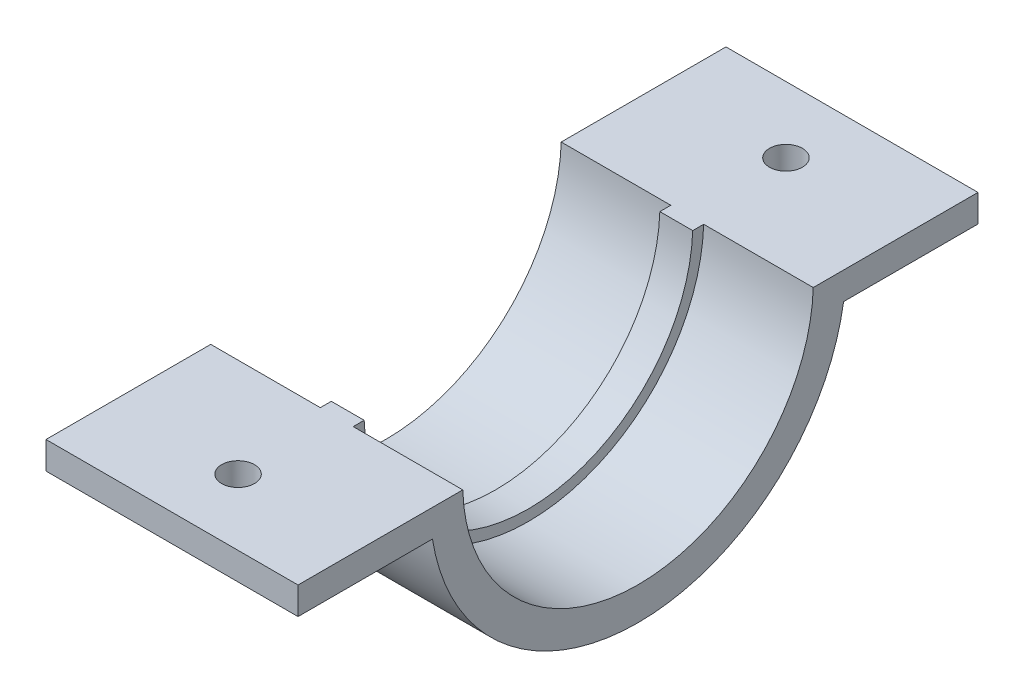
ISO-10303-21;
HEADER;
FILE_DESCRIPTION(('STEP AP214'),'2;1');
FILE_NAME('part.step','',(''),(''),'','','');
FILE_SCHEMA(('AUTOMOTIVE_DESIGN { 1 0 10303 214 1 1 1 1 }'));
ENDSEC;
DATA;
#1=APPLICATION_CONTEXT('core data for automotive mechanical design processes');
#2=APPLICATION_PROTOCOL_DEFINITION('international standard','automotive_design',2000,#1);
#3=PRODUCT_CONTEXT('',#1,'mechanical');
#4=PRODUCT('Part','Part','',(#3));
#5=PRODUCT_RELATED_PRODUCT_CATEGORY('part','',(#4));
#6=PRODUCT_DEFINITION_FORMATION('','',#4);
#7=PRODUCT_DEFINITION_CONTEXT('part definition',#1,'design');
#8=PRODUCT_DEFINITION('design','',#6,#7);
#9=PRODUCT_DEFINITION_SHAPE('','',#8);
#10=(LENGTH_UNIT() NAMED_UNIT(*) SI_UNIT(.MILLI.,.METRE.));
#11=(NAMED_UNIT(*) PLANE_ANGLE_UNIT() SI_UNIT($,.RADIAN.));
#12=(NAMED_UNIT(*) SI_UNIT($,.STERADIAN.) SOLID_ANGLE_UNIT());
#13=UNCERTAINTY_MEASURE_WITH_UNIT(LENGTH_MEASURE(1.E-05),#10,'distance_accuracy_value','');
#14=(GEOMETRIC_REPRESENTATION_CONTEXT(3) GLOBAL_UNCERTAINTY_ASSIGNED_CONTEXT((#13)) GLOBAL_UNIT_ASSIGNED_CONTEXT((#10,
#11,#12)) REPRESENTATION_CONTEXT('',''));
#15=CARTESIAN_POINT('',(0.,0.,0.));
#16=DIRECTION('',(0.,0.,1.));
#17=DIRECTION('',(1.,0.,0.));
#18=AXIS2_PLACEMENT_3D('',#15,#16,#17);
#19=CARTESIAN_POINT('',(-11.5,0.,-16.));
#20=DIRECTION('',(1.,0.,0.));
#21=DIRECTION('',(0.,0.,-1.));
#22=AXIS2_PLACEMENT_3D('',#19,#20,#21);
#23=PLANE('',#22);
#24=DIRECTION('',(0.,-1.,0.));
#25=VECTOR('',#24,1.);
#26=CARTESIAN_POINT('',(-11.5,3.,31.0262507904691));
#27=LINE('',#26,#25);
#28=CARTESIAN_POINT('',(-11.5,-0.5,31.0262507904691));
#29=VERTEX_POINT('',#28);
#30=CARTESIAN_POINT('',(-11.5,-3.,31.0262507904691));
#31=VERTEX_POINT('',#30);
#32=EDGE_CURVE('E181',#29,#31,#27,.T.);
#33=ORIENTED_EDGE('',*,*,#32,.F.);
#34=DIRECTION('',(0.,0.,-1.));
#35=VECTOR('',#34,1.);
#36=CARTESIAN_POINT('',(-11.5,-0.5,-16.));
#37=LINE('',#36,#35);
#38=CARTESIAN_POINT('',(-11.5,-0.5,15.9921855917195));
#39=VERTEX_POINT('',#38);
#40=EDGE_CURVE('E83',#29,#39,#37,.T.);
#41=ORIENTED_EDGE('',*,*,#40,.T.);
#42=CARTESIAN_POINT('',(-11.5,0.,0.));
#43=DIRECTION('',(-1.,0.,0.));
#44=DIRECTION('',(0.,0.,1.));
#45=AXIS2_PLACEMENT_3D('',#42,#43,#44);
#46=CIRCLE('',#45,16.);
#47=CARTESIAN_POINT('',(-11.5,-0.5,-15.9921855917195));
#48=VERTEX_POINT('',#47);
#49=EDGE_CURVE('E175',#48,#39,#46,.T.);
#50=ORIENTED_EDGE('',*,*,#49,.F.);
#51=CARTESIAN_POINT('',(-11.5,-0.5,-31.0262507904691));
#52=VERTEX_POINT('',#51);
#53=EDGE_CURVE('E207',#48,#52,#37,.T.);
#54=ORIENTED_EDGE('',*,*,#53,.T.);
#55=DIRECTION('',(0.,1.,0.));
#56=VECTOR('',#55,1.);
#57=CARTESIAN_POINT('',(-11.5,3.00000000000001,-31.0262507904691));
#58=LINE('',#57,#56);
#59=CARTESIAN_POINT('',(-11.5,-2.99999999999998,-31.0262507904691));
#60=VERTEX_POINT('',#59);
#61=EDGE_CURVE('E184',#60,#52,#58,.T.);
#62=ORIENTED_EDGE('',*,*,#61,.F.);
#63=DIRECTION('',(0.,0.,-1.));
#64=VECTOR('',#63,1.);
#65=CARTESIAN_POINT('',(-11.5,-2.99999999999999,-17.4601205824056));
#66=LINE('',#65,#64);
#67=CARTESIAN_POINT('',(-11.5,-2.99999999999998,-18.7616630392937));
#68=VERTEX_POINT('',#67);
#69=EDGE_CURVE('E225',#68,#60,#66,.T.);
#70=ORIENTED_EDGE('',*,*,#69,.F.);
#71=CARTESIAN_POINT('',(-11.5,0.,0.));
#72=DIRECTION('',(-1.,0.,0.));
#73=DIRECTION('',(0.,0.,1.));
#74=AXIS2_PLACEMENT_3D('',#71,#72,#73);
#75=CIRCLE('',#74,19.);
#76=CARTESIAN_POINT('',(-11.5,-3.,18.7616630392937));
#77=VERTEX_POINT('',#76);
#78=EDGE_CURVE('E212',#68,#77,#75,.T.);
#79=ORIENTED_EDGE('',*,*,#78,.T.);
#80=DIRECTION('',(0.,0.,-1.));
#81=VECTOR('',#80,1.);
#82=CARTESIAN_POINT('',(-11.5,-3.,17.4601205824056));
#83=LINE('',#82,#81);
#84=EDGE_CURVE('E228',#31,#77,#83,.T.);
#85=ORIENTED_EDGE('',*,*,#84,.F.);
#86=EDGE_LOOP('',(#33,#41,#50,#54,#62,#70,#79,#85));
#87=FACE_BOUND('',#86,.T.);
#88=ADVANCED_FACE('F40',(#87),#23,.F.);
#89=CARTESIAN_POINT('',(11.5,0.,-16.));
#90=DIRECTION('',(-1.,0.,0.));
#91=DIRECTION('',(0.,0.,1.));
#92=AXIS2_PLACEMENT_3D('',#89,#90,#91);
#93=PLANE('',#92);
#94=DIRECTION('',(0.,1.,0.));
#95=VECTOR('',#94,1.);
#96=CARTESIAN_POINT('',(11.5,3.00000000000001,-31.0262507904691));
#97=LINE('',#96,#95);
#98=CARTESIAN_POINT('',(11.5,-2.99999999999998,-31.0262507904691));
#99=VERTEX_POINT('',#98);
#100=CARTESIAN_POINT('',(11.5,-0.5,-31.0262507904691));
#101=VERTEX_POINT('',#100);
#102=EDGE_CURVE('E44',#99,#101,#97,.T.);
#103=ORIENTED_EDGE('',*,*,#102,.T.);
#104=DIRECTION('',(0.,0.,1.));
#105=VECTOR('',#104,1.);
#106=CARTESIAN_POINT('',(11.5,-0.5,-16.));
#107=LINE('',#106,#105);
#108=CARTESIAN_POINT('',(11.5,-0.5,-15.9921855917195));
#109=VERTEX_POINT('',#108);
#110=EDGE_CURVE('E134',#101,#109,#107,.T.);
#111=ORIENTED_EDGE('',*,*,#110,.T.);
#112=CARTESIAN_POINT('',(11.5,0.,0.));
#113=DIRECTION('',(-1.,0.,0.));
#114=DIRECTION('',(0.,0.,1.));
#115=AXIS2_PLACEMENT_3D('',#112,#113,#114);
#116=CIRCLE('',#115,16.);
#117=CARTESIAN_POINT('',(11.5,-0.5,15.9921855917195));
#118=VERTEX_POINT('',#117);
#119=EDGE_CURVE('E148',#109,#118,#116,.T.);
#120=ORIENTED_EDGE('',*,*,#119,.T.);
#121=CARTESIAN_POINT('',(11.5,-0.5,31.0262507904691));
#122=VERTEX_POINT('',#121);
#123=EDGE_CURVE('E151',#118,#122,#107,.T.);
#124=ORIENTED_EDGE('',*,*,#123,.T.);
#125=DIRECTION('',(0.,-1.,0.));
#126=VECTOR('',#125,1.);
#127=CARTESIAN_POINT('',(11.5,3.,31.0262507904691));
#128=LINE('',#127,#126);
#129=CARTESIAN_POINT('',(11.5,-3.,31.0262507904691));
#130=VERTEX_POINT('',#129);
#131=EDGE_CURVE('E154',#122,#130,#128,.T.);
#132=ORIENTED_EDGE('',*,*,#131,.T.);
#133=DIRECTION('',(0.,0.,-1.));
#134=VECTOR('',#133,1.);
#135=CARTESIAN_POINT('',(11.5,-3.,17.4601205824056));
#136=LINE('',#135,#134);
#137=CARTESIAN_POINT('',(11.5,-3.,18.7616630392938));
#138=VERTEX_POINT('',#137);
#139=EDGE_CURVE('E180',#130,#138,#136,.T.);
#140=ORIENTED_EDGE('',*,*,#139,.T.);
#141=CARTESIAN_POINT('',(11.5,0.,0.));
#142=DIRECTION('',(-1.,0.,0.));
#143=DIRECTION('',(0.,0.,1.));
#144=AXIS2_PLACEMENT_3D('',#141,#142,#143);
#145=CIRCLE('',#144,19.);
#146=CARTESIAN_POINT('',(11.5,-2.99999999999999,-18.7616630392938));
#147=VERTEX_POINT('',#146);
#148=EDGE_CURVE('E157',#147,#138,#145,.T.);
#149=ORIENTED_EDGE('',*,*,#148,.F.);
#150=DIRECTION('',(0.,0.,-1.));
#151=VECTOR('',#150,1.);
#152=CARTESIAN_POINT('',(11.5,-2.99999999999999,-17.4601205824056));
#153=LINE('',#152,#151);
#154=EDGE_CURVE('E161',#147,#99,#153,.T.);
#155=ORIENTED_EDGE('',*,*,#154,.T.);
#156=EDGE_LOOP('',(#103,#111,#120,#124,#132,#140,#149,#155));
#157=FACE_BOUND('',#156,.T.);
#158=ADVANCED_FACE('F146',(#157),#93,.F.);
#159=CARTESIAN_POINT('',(-71.7221553746751,0.,0.));
#160=DIRECTION('',(-1.,0.,0.));
#161=DIRECTION('',(0.,0.,1.));
#162=AXIS2_PLACEMENT_3D('',#159,#160,#161);
#163=CYLINDRICAL_SURFACE('',#162,16.);
#164=CARTESIAN_POINT('',(1.5,0.,0.));
#165=DIRECTION('',(-1.,0.,0.));
#166=DIRECTION('',(0.,0.,1.));
#167=AXIS2_PLACEMENT_3D('',#164,#165,#166);
#168=CIRCLE('',#167,16.);
#169=CARTESIAN_POINT('',(1.5,-0.5,-15.9921855917195));
#170=VERTEX_POINT('',#169);
#171=CARTESIAN_POINT('',(1.5,-0.5,15.9921855917195));
#172=VERTEX_POINT('',#171);
#173=EDGE_CURVE('E159',#170,#172,#168,.T.);
#174=ORIENTED_EDGE('',*,*,#173,.T.);
#175=DIRECTION('',(-1.,0.,0.));
#176=VECTOR('',#175,1.);
#177=CARTESIAN_POINT('',(-71.7221553746751,-0.5,15.9921855917195));
#178=LINE('',#177,#176);
#179=EDGE_CURVE('E59',#172,#118,#178,.F.);
#180=ORIENTED_EDGE('',*,*,#179,.T.);
#181=ORIENTED_EDGE('',*,*,#119,.F.);
#182=DIRECTION('',(-1.,0.,0.));
#183=VECTOR('',#182,1.);
#184=CARTESIAN_POINT('',(-71.7221553746751,-0.5,-15.9921855917195));
#185=LINE('',#184,#183);
#186=EDGE_CURVE('E130',#109,#170,#185,.T.);
#187=ORIENTED_EDGE('',*,*,#186,.T.);
#188=EDGE_LOOP('',(#174,#180,#181,#187));
#189=FACE_BOUND('',#188,.T.);
#190=ADVANCED_FACE('F152',(#189),#163,.F.);
#191=CARTESIAN_POINT('',(1.5,0.,-16.));
#192=DIRECTION('',(-1.,0.,0.));
#193=DIRECTION('',(0.,0.,1.));
#194=AXIS2_PLACEMENT_3D('',#191,#192,#193);
#195=PLANE('',#194);
#196=ORIENTED_EDGE('',*,*,#173,.F.);
#197=DIRECTION('',(0.,0.,1.));
#198=VECTOR('',#197,1.);
#199=CARTESIAN_POINT('',(1.5,-0.5,-16.));
#200=LINE('',#199,#198);
#201=CARTESIAN_POINT('',(1.5,-0.5,-14.991664350565));
#202=VERTEX_POINT('',#201);
#203=EDGE_CURVE('E137',#170,#202,#200,.T.);
#204=ORIENTED_EDGE('',*,*,#203,.T.);
#205=CARTESIAN_POINT('',(1.5,0.,0.));
#206=DIRECTION('',(-1.,0.,0.));
#207=DIRECTION('',(0.,0.,1.));
#208=AXIS2_PLACEMENT_3D('',#205,#206,#207);
#209=CIRCLE('',#208,15.);
#210=CARTESIAN_POINT('',(1.5,-0.5,14.991664350565));
#211=VERTEX_POINT('',#210);
#212=EDGE_CURVE('E162',#202,#211,#209,.T.);
#213=ORIENTED_EDGE('',*,*,#212,.T.);
#214=EDGE_CURVE('E165',#211,#172,#200,.T.);
#215=ORIENTED_EDGE('',*,*,#214,.T.);
#216=EDGE_LOOP('',(#196,#204,#213,#215));
#217=FACE_BOUND('',#216,.T.);
#218=ADVANCED_FACE('F270',(#217),#195,.F.);
#219=CARTESIAN_POINT('',(-71.7221553746751,0.,0.));
#220=DIRECTION('',(-1.,0.,0.));
#221=DIRECTION('',(0.,0.,1.));
#222=AXIS2_PLACEMENT_3D('',#219,#220,#221);
#223=CYLINDRICAL_SURFACE('',#222,15.);
#224=CARTESIAN_POINT('',(-1.5,0.,0.));
#225=DIRECTION('',(-1.,0.,0.));
#226=DIRECTION('',(0.,0.,1.));
#227=AXIS2_PLACEMENT_3D('',#224,#225,#226);
#228=CIRCLE('',#227,15.);
#229=CARTESIAN_POINT('',(-1.5,-0.5,-14.9916643505649));
#230=VERTEX_POINT('',#229);
#231=CARTESIAN_POINT('',(-1.5,-0.5,14.9916643505649));
#232=VERTEX_POINT('',#231);
#233=EDGE_CURVE('E166',#230,#232,#228,.T.);
#234=ORIENTED_EDGE('',*,*,#233,.T.);
#235=DIRECTION('',(-1.,0.,0.));
#236=VECTOR('',#235,1.);
#237=CARTESIAN_POINT('',(-71.7221553746751,-0.5,14.991664350565));
#238=LINE('',#237,#236);
#239=EDGE_CURVE('E169',#232,#211,#238,.F.);
#240=ORIENTED_EDGE('',*,*,#239,.T.);
#241=ORIENTED_EDGE('',*,*,#212,.F.);
#242=DIRECTION('',(-1.,0.,0.));
#243=VECTOR('',#242,1.);
#244=CARTESIAN_POINT('',(-71.7221553746751,-0.5,-14.991664350565));
#245=LINE('',#244,#243);
#246=EDGE_CURVE('E174',#202,#230,#245,.T.);
#247=ORIENTED_EDGE('',*,*,#246,.T.);
#248=EDGE_LOOP('',(#234,#240,#241,#247));
#249=FACE_BOUND('',#248,.T.);
#250=ADVANCED_FACE('F268',(#249),#223,.F.);
#251=CARTESIAN_POINT('',(-1.5,0.,-16.));
#252=DIRECTION('',(1.,0.,0.));
#253=DIRECTION('',(0.,0.,-1.));
#254=AXIS2_PLACEMENT_3D('',#251,#252,#253);
#255=PLANE('',#254);
#256=CARTESIAN_POINT('',(-1.5,0.,0.));
#257=DIRECTION('',(-1.,0.,0.));
#258=DIRECTION('',(0.,0.,1.));
#259=AXIS2_PLACEMENT_3D('',#256,#257,#258);
#260=CIRCLE('',#259,16.);
#261=CARTESIAN_POINT('',(-1.5,-0.5,-15.9921855917195));
#262=VERTEX_POINT('',#261);
#263=CARTESIAN_POINT('',(-1.5,-0.5,15.9921855917195));
#264=VERTEX_POINT('',#263);
#265=EDGE_CURVE('E170',#262,#264,#260,.T.);
#266=ORIENTED_EDGE('',*,*,#265,.T.);
#267=DIRECTION('',(0.,0.,-1.));
#268=VECTOR('',#267,1.);
#269=CARTESIAN_POINT('',(-1.5,-0.5,-16.));
#270=LINE('',#269,#268);
#271=EDGE_CURVE('E173',#264,#232,#270,.T.);
#272=ORIENTED_EDGE('',*,*,#271,.T.);
#273=ORIENTED_EDGE('',*,*,#233,.F.);
#274=EDGE_CURVE('E178',#230,#262,#270,.T.);
#275=ORIENTED_EDGE('',*,*,#274,.T.);
#276=EDGE_LOOP('',(#266,#272,#273,#275));
#277=FACE_BOUND('',#276,.T.);
#278=ADVANCED_FACE('F263',(#277),#255,.F.);
#279=CARTESIAN_POINT('',(-71.7221553746751,0.,0.));
#280=DIRECTION('',(-1.,0.,0.));
#281=DIRECTION('',(0.,0.,1.));
#282=AXIS2_PLACEMENT_3D('',#279,#280,#281);
#283=CYLINDRICAL_SURFACE('',#282,16.);
#284=ORIENTED_EDGE('',*,*,#49,.T.);
#285=DIRECTION('',(-1.,0.,0.));
#286=VECTOR('',#285,1.);
#287=CARTESIAN_POINT('',(-71.7221553746751,-0.5,15.9921855917195));
#288=LINE('',#287,#286);
#289=EDGE_CURVE('E79',#39,#264,#288,.F.);
#290=ORIENTED_EDGE('',*,*,#289,.T.);
#291=ORIENTED_EDGE('',*,*,#265,.F.);
#292=DIRECTION('',(-1.,0.,0.));
#293=VECTOR('',#292,1.);
#294=CARTESIAN_POINT('',(-71.7221553746751,-0.5,-15.9921855917195));
#295=LINE('',#294,#293);
#296=EDGE_CURVE('E187',#262,#48,#295,.T.);
#297=ORIENTED_EDGE('',*,*,#296,.T.);
#298=EDGE_LOOP('',(#284,#290,#291,#297));
#299=FACE_BOUND('',#298,.T.);
#300=ADVANCED_FACE('F261',(#299),#283,.F.);
#301=CARTESIAN_POINT('',(11.5,3.00000000000001,-31.0262507904691));
#302=DIRECTION('',(0.,0.,1.));
#303=DIRECTION('',(1.,0.,0.));
#304=AXIS2_PLACEMENT_3D('',#301,#302,#303);
#305=PLANE('',#304);
#306=ORIENTED_EDGE('',*,*,#61,.T.);
#307=DIRECTION('',(1.,0.,0.));
#308=VECTOR('',#307,1.);
#309=CARTESIAN_POINT('',(11.5,-0.5,-31.0262507904691));
#310=LINE('',#309,#308);
#311=EDGE_CURVE('E186',#52,#101,#310,.T.);
#312=ORIENTED_EDGE('',*,*,#311,.T.);
#313=ORIENTED_EDGE('',*,*,#102,.F.);
#314=DIRECTION('',(-1.,0.,0.));
#315=VECTOR('',#314,1.);
#316=CARTESIAN_POINT('',(11.5,-2.99999999999998,-31.0262507904691));
#317=LINE('',#316,#315);
#318=EDGE_CURVE('E191',#99,#60,#317,.T.);
#319=ORIENTED_EDGE('',*,*,#318,.T.);
#320=EDGE_LOOP('',(#306,#312,#313,#319));
#321=FACE_BOUND('',#320,.T.);
#322=ADVANCED_FACE('F220',(#321),#305,.F.);
#323=CARTESIAN_POINT('',(11.5,3.,31.0262507904691));
#324=DIRECTION('',(0.,0.,-1.));
#325=DIRECTION('',(-1.,0.,0.));
#326=AXIS2_PLACEMENT_3D('',#323,#324,#325);
#327=PLANE('',#326);
#328=ORIENTED_EDGE('',*,*,#131,.F.);
#329=DIRECTION('',(-1.,0.,0.));
#330=VECTOR('',#329,1.);
#331=CARTESIAN_POINT('',(11.5,-0.5,31.0262507904691));
#332=LINE('',#331,#330);
#333=EDGE_CURVE('E183',#122,#29,#332,.T.);
#334=ORIENTED_EDGE('',*,*,#333,.T.);
#335=ORIENTED_EDGE('',*,*,#32,.T.);
#336=DIRECTION('',(-1.,0.,0.));
#337=VECTOR('',#336,1.);
#338=CARTESIAN_POINT('',(11.5,-3.,31.0262507904691));
#339=LINE('',#338,#337);
#340=EDGE_CURVE('E11',#130,#31,#339,.T.);
#341=ORIENTED_EDGE('',*,*,#340,.F.);
#342=EDGE_LOOP('',(#328,#334,#335,#341));
#343=FACE_BOUND('',#342,.T.);
#344=ADVANCED_FACE('F260',(#343),#327,.F.);
#345=CARTESIAN_POINT('',(0.,-11.5,25.));
#346=DIRECTION('',(0.,1.,0.));
#347=DIRECTION('',(0.,0.,1.));
#348=AXIS2_PLACEMENT_3D('',#345,#346,#347);
#349=CYLINDRICAL_SURFACE('',#348,1.5);
#350=CARTESIAN_POINT('',(0.,-0.5,25.));
#351=DIRECTION('',(0.,-1.,0.));
#352=DIRECTION('',(0.,0.,-1.));
#353=AXIS2_PLACEMENT_3D('',#350,#351,#352);
#354=CIRCLE('',#353,1.5);
#355=CARTESIAN_POINT('',(0.,-0.5,23.5));
#356=VERTEX_POINT('',#355);
#357=EDGE_CURVE('E182',#356,#356,#354,.F.);
#358=ORIENTED_EDGE('',*,*,#357,.T.);
#359=EDGE_LOOP('',(#358));
#360=FACE_BOUND('',#359,.T.);
#361=CARTESIAN_POINT('',(0.,-3.,25.));
#362=DIRECTION('',(0.,1.,0.));
#363=DIRECTION('',(0.,0.,1.));
#364=AXIS2_PLACEMENT_3D('',#361,#362,#363);
#365=CIRCLE('',#364,1.5);
#366=CARTESIAN_POINT('',(0.,-3.,26.5));
#367=VERTEX_POINT('',#366);
#368=EDGE_CURVE('E230',#367,#367,#365,.T.);
#369=ORIENTED_EDGE('',*,*,#368,.F.);
#370=EDGE_LOOP('',(#369));
#371=FACE_BOUND('',#370,.T.);
#372=ADVANCED_FACE('F42',(#360,#371),#349,.F.);
#373=CARTESIAN_POINT('',(0.,-11.5,-25.));
#374=DIRECTION('',(0.,1.,0.));
#375=DIRECTION('',(0.,0.,1.));
#376=AXIS2_PLACEMENT_3D('',#373,#374,#375);
#377=CYLINDRICAL_SURFACE('',#376,1.5);
#378=CARTESIAN_POINT('',(0.,-0.5,-25.));
#379=DIRECTION('',(0.,-1.,0.));
#380=DIRECTION('',(0.,0.,-1.));
#381=AXIS2_PLACEMENT_3D('',#378,#379,#380);
#382=CIRCLE('',#381,1.5);
#383=CARTESIAN_POINT('',(0.,-0.5,-26.5));
#384=VERTEX_POINT('',#383);
#385=EDGE_CURVE('E211',#384,#384,#382,.F.);
#386=ORIENTED_EDGE('',*,*,#385,.T.);
#387=EDGE_LOOP('',(#386));
#388=FACE_BOUND('',#387,.T.);
#389=CARTESIAN_POINT('',(0.,-2.99999999999998,-25.));
#390=DIRECTION('',(0.,1.,0.));
#391=DIRECTION('',(0.,0.,1.));
#392=AXIS2_PLACEMENT_3D('',#389,#390,#391);
#393=CIRCLE('',#392,1.5);
#394=CARTESIAN_POINT('',(0.,-2.99999999999998,-23.5));
#395=VERTEX_POINT('',#394);
#396=EDGE_CURVE('E233',#395,#395,#393,.T.);
#397=ORIENTED_EDGE('',*,*,#396,.F.);
#398=EDGE_LOOP('',(#397));
#399=FACE_BOUND('',#398,.T.);
#400=ADVANCED_FACE('F289',(#388,#399),#377,.F.);
#401=CARTESIAN_POINT('',(-71.7221553746751,0.,0.));
#402=DIRECTION('',(-1.,0.,0.));
#403=DIRECTION('',(0.,0.,1.));
#404=AXIS2_PLACEMENT_3D('',#401,#402,#403);
#405=CYLINDRICAL_SURFACE('',#404,19.);
#406=DIRECTION('',(-1.,0.,0.));
#407=VECTOR('',#406,1.);
#408=CARTESIAN_POINT('',(-71.7221553746751,-3.,18.7616630392937));
#409=LINE('',#408,#407);
#410=EDGE_CURVE('E50',#77,#138,#409,.F.);
#411=ORIENTED_EDGE('',*,*,#410,.F.);
#412=ORIENTED_EDGE('',*,*,#78,.F.);
#413=DIRECTION('',(-1.,0.,0.));
#414=VECTOR('',#413,1.);
#415=CARTESIAN_POINT('',(-71.7221553746751,-2.99999999999999,-18.7616630392937));
#416=LINE('',#415,#414);
#417=EDGE_CURVE('E235',#147,#68,#416,.T.);
#418=ORIENTED_EDGE('',*,*,#417,.F.);
#419=ORIENTED_EDGE('',*,*,#148,.T.);
#420=EDGE_LOOP('',(#411,#412,#418,#419));
#421=FACE_BOUND('',#420,.T.);
#422=ADVANCED_FACE('F253',(#421),#405,.T.);
#423=CARTESIAN_POINT('',(11.5,-2.99999999999999,-17.4601205824056));
#424=DIRECTION('',(0.,1.,0.));
#425=DIRECTION('',(0.,0.,1.));
#426=AXIS2_PLACEMENT_3D('',#423,#424,#425);
#427=PLANE('',#426);
#428=ORIENTED_EDGE('',*,*,#396,.T.);
#429=EDGE_LOOP('',(#428));
#430=FACE_BOUND('',#429,.T.);
#431=ORIENTED_EDGE('',*,*,#154,.F.);
#432=ORIENTED_EDGE('',*,*,#417,.T.);
#433=ORIENTED_EDGE('',*,*,#69,.T.);
#434=ORIENTED_EDGE('',*,*,#318,.F.);
#435=EDGE_LOOP('',(#431,#432,#433,#434));
#436=FACE_BOUND('',#435,.T.);
#437=ADVANCED_FACE('F252',(#430,#436),#427,.F.);
#438=CARTESIAN_POINT('',(11.5,-3.,17.4601205824056));
#439=DIRECTION('',(0.,1.,0.));
#440=DIRECTION('',(0.,0.,1.));
#441=AXIS2_PLACEMENT_3D('',#438,#439,#440);
#442=PLANE('',#441);
#443=ORIENTED_EDGE('',*,*,#368,.T.);
#444=EDGE_LOOP('',(#443));
#445=FACE_BOUND('',#444,.T.);
#446=ORIENTED_EDGE('',*,*,#84,.T.);
#447=ORIENTED_EDGE('',*,*,#410,.T.);
#448=ORIENTED_EDGE('',*,*,#139,.F.);
#449=ORIENTED_EDGE('',*,*,#340,.T.);
#450=EDGE_LOOP('',(#446,#447,#448,#449));
#451=FACE_BOUND('',#450,.T.);
#452=ADVANCED_FACE('F256',(#445,#451),#442,.F.);
#453=CARTESIAN_POINT('',(-26.,-0.5,37.8752027899532));
#454=DIRECTION('',(0.,-1.,0.));
#455=DIRECTION('',(0.,0.,-1.));
#456=AXIS2_PLACEMENT_3D('',#453,#454,#455);
#457=PLANE('',#456);
#458=ORIENTED_EDGE('',*,*,#385,.F.);
#459=EDGE_LOOP('',(#458));
#460=FACE_BOUND('',#459,.T.);
#461=ORIENTED_EDGE('',*,*,#110,.F.);
#462=ORIENTED_EDGE('',*,*,#311,.F.);
#463=ORIENTED_EDGE('',*,*,#53,.F.);
#464=ORIENTED_EDGE('',*,*,#296,.F.);
#465=ORIENTED_EDGE('',*,*,#274,.F.);
#466=ORIENTED_EDGE('',*,*,#246,.F.);
#467=ORIENTED_EDGE('',*,*,#203,.F.);
#468=ORIENTED_EDGE('',*,*,#186,.F.);
#469=EDGE_LOOP('',(#461,#462,#463,#464,#465,#466,#467,#468));
#470=FACE_BOUND('',#469,.T.);
#471=ADVANCED_FACE('F132',(#460,#470),#457,.F.);
#472=ORIENTED_EDGE('',*,*,#357,.F.);
#473=EDGE_LOOP('',(#472));
#474=FACE_BOUND('',#473,.T.);
#475=ORIENTED_EDGE('',*,*,#214,.F.);
#476=ORIENTED_EDGE('',*,*,#239,.F.);
#477=ORIENTED_EDGE('',*,*,#271,.F.);
#478=ORIENTED_EDGE('',*,*,#289,.F.);
#479=ORIENTED_EDGE('',*,*,#40,.F.);
#480=ORIENTED_EDGE('',*,*,#333,.F.);
#481=ORIENTED_EDGE('',*,*,#123,.F.);
#482=ORIENTED_EDGE('',*,*,#179,.F.);
#483=EDGE_LOOP('',(#475,#476,#477,#478,#479,#480,#481,#482));
#484=FACE_BOUND('',#483,.T.);
#485=ADVANCED_FACE('F271',(#474,#484),#457,.F.);
#486=CLOSED_SHELL('',(#88,#158,#190,#218,#250,#278,#300,#322,#344,#372,#400,#422,#437,#452,#471,#485));
#487=MANIFOLD_SOLID_BREP('B2',#486);
#488=ADVANCED_BREP_SHAPE_REPRESENTATION('',(#18,#487),#14);
#489=SHAPE_DEFINITION_REPRESENTATION(#9,#488);
ENDSEC;
END-ISO-10303-21;
